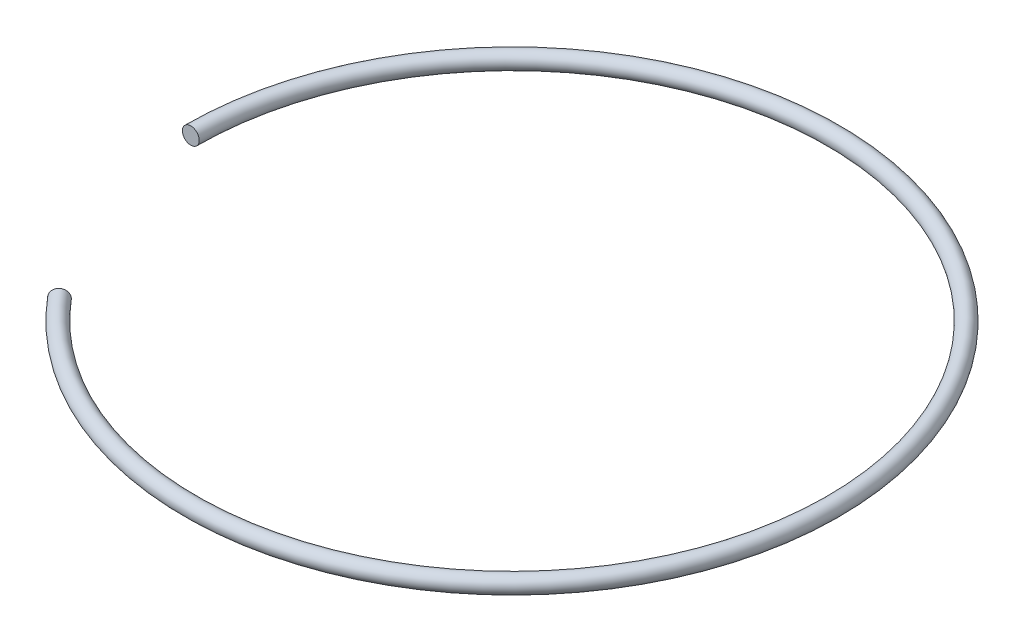
ISO-10303-21;
HEADER;
FILE_DESCRIPTION(('STEP AP214'),'2;1');
FILE_NAME('part.step','',(''),(''),'','','');
FILE_SCHEMA(('AUTOMOTIVE_DESIGN { 1 0 10303 214 1 1 1 1 }'));
ENDSEC;
DATA;
#1=APPLICATION_CONTEXT('core data for automotive mechanical design processes');
#2=APPLICATION_PROTOCOL_DEFINITION('international standard','automotive_design',2000,#1);
#3=PRODUCT_CONTEXT('',#1,'mechanical');
#4=PRODUCT('Part','Part','',(#3));
#5=PRODUCT_RELATED_PRODUCT_CATEGORY('part','',(#4));
#6=PRODUCT_DEFINITION_FORMATION('','',#4);
#7=PRODUCT_DEFINITION_CONTEXT('part definition',#1,'design');
#8=PRODUCT_DEFINITION('design','',#6,#7);
#9=PRODUCT_DEFINITION_SHAPE('','',#8);
#10=(LENGTH_UNIT() NAMED_UNIT(*) SI_UNIT(.MILLI.,.METRE.));
#11=(NAMED_UNIT(*) PLANE_ANGLE_UNIT() SI_UNIT($,.RADIAN.));
#12=(NAMED_UNIT(*) SI_UNIT($,.STERADIAN.) SOLID_ANGLE_UNIT());
#13=UNCERTAINTY_MEASURE_WITH_UNIT(LENGTH_MEASURE(1.E-05),#10,'distance_accuracy_value','');
#14=(GEOMETRIC_REPRESENTATION_CONTEXT(3) GLOBAL_UNCERTAINTY_ASSIGNED_CONTEXT((#13)) GLOBAL_UNIT_ASSIGNED_CONTEXT((#10,
#11,#12)) REPRESENTATION_CONTEXT('',''));
#15=CARTESIAN_POINT('',(0.,0.,0.));
#16=DIRECTION('',(0.,0.,1.));
#17=DIRECTION('',(1.,0.,0.));
#18=AXIS2_PLACEMENT_3D('',#15,#16,#17);
#19=CARTESIAN_POINT('',(0.,5.,0.));
#20=DIRECTION('',(0.,0.,1.));
#21=DIRECTION('',(1.,0.,0.));
#22=AXIS2_PLACEMENT_3D('',#19,#20,#21);
#23=PLANE('',#22);
#24=CARTESIAN_POINT('',(-5.575,0.440000000000001,0.));
#25=CARTESIAN_POINT('',(-5.57501062983499,0.42319249164499,0.));
#26=CARTESIAN_POINT('',(-5.57787538462174,0.406281558710685,0.));
#27=CARTESIAN_POINT('',(-5.58903597751349,0.374416764003044,0.));
#28=CARTESIAN_POINT('',(-5.59733181561848,0.359462902229706,0.));
#29=CARTESIAN_POINT('',(-5.61840700512756,0.333129254032241,0.));
#30=CARTESIAN_POINT('',(-5.63118635653177,0.321749467608205,0.));
#31=CARTESIAN_POINT('',(-5.65979109373738,0.303865334950795,0.));
#32=CARTESIAN_POINT('',(-5.67561647953878,0.297360988717422,0.));
#33=CARTESIAN_POINT('',(-5.70852818642906,0.289956461444852,0.));
#34=CARTESIAN_POINT('',(-5.72561450751794,0.289056280405655,0.));
#35=CARTESIAN_POINT('',(-5.75912206349802,0.292961554634673,0.));
#36=CARTESIAN_POINT('',(-5.77554329838922,0.297767009902889,0.));
#37=CARTESIAN_POINT('',(-5.80586889279606,0.312546438693667,0.));
#38=CARTESIAN_POINT('',(-5.81977325231169,0.322520412216229,0.));
#39=CARTESIAN_POINT('',(-5.84349883134805,0.346493762829983,0.));
#40=CARTESIAN_POINT('',(-5.85332005086878,0.360493139921175,0.));
#41=CARTESIAN_POINT('',(-5.86776711566352,0.391008812850514,0.));
#42=CARTESIAN_POINT('',(-5.87239296093752,0.40752510868866,0.));
#43=CARTESIAN_POINT('',(-5.87472637429642,0.429476017085077,0.));
#44=CARTESIAN_POINT('',(-5.87500333113523,0.434732930161899,0.));
#45=CARTESIAN_POINT('',(-5.87498937016501,0.456807508355013,0.));
#46=CARTESIAN_POINT('',(-5.87212461537826,0.473718441289317,0.));
#47=CARTESIAN_POINT('',(-5.86096402248651,0.505583235996959,0.));
#48=CARTESIAN_POINT('',(-5.85266818438152,0.520537097770296,0.));
#49=CARTESIAN_POINT('',(-5.83159299487244,0.546870745967761,0.));
#50=CARTESIAN_POINT('',(-5.81881364346823,0.558250532391798,0.));
#51=CARTESIAN_POINT('',(-5.79020890626262,0.576134665049207,0.));
#52=CARTESIAN_POINT('',(-5.77438352046122,0.58263901128258,0.));
#53=CARTESIAN_POINT('',(-5.74147181357094,0.59004353855515,0.));
#54=CARTESIAN_POINT('',(-5.72438549248206,0.590943719594348,0.));
#55=CARTESIAN_POINT('',(-5.69087793650198,0.587038445365329,0.));
#56=CARTESIAN_POINT('',(-5.67445670161078,0.582232990097113,0.));
#57=CARTESIAN_POINT('',(-5.64413110720394,0.567453561306335,0.));
#58=CARTESIAN_POINT('',(-5.63022674768831,0.557479587783773,0.));
#59=CARTESIAN_POINT('',(-5.60650116865195,0.533506237170019,0.));
#60=CARTESIAN_POINT('',(-5.59667994913122,0.519506860078827,0.));
#61=CARTESIAN_POINT('',(-5.58223288433648,0.488991187149488,0.));
#62=CARTESIAN_POINT('',(-5.57760703906248,0.472474891311342,0.));
#63=CARTESIAN_POINT('',(-5.57527362570358,0.450523982914926,0.));
#64=CARTESIAN_POINT('',(-5.57499666886477,0.445267069838103,0.));
#65=CARTESIAN_POINT('',(-5.575,0.440000000000001,0.));
#66=B_SPLINE_CURVE_WITH_KNOTS('',3,(#24,#25,#26,#27,#28,#29,#30,#31,#32,#33,#34,#35,#36,#37,#38,
#39,#40,#41,#42,#43,#44,#45,#46,#47,#48,#49,#50,#51,#52,#53,#54,#55,#56,#57,#58,#59,#60,#61,#62,
#63,#64,#65),.UNSPECIFIED.,.T.,.F.,(4,2,2,2,2,2,2,2,2,2,2,2,2,2,2,2,2,2,2,2,4),(0.,
0.0503657057955508,0.100731411591102,0.151097117387924,0.201462823184746,0.251828528981568,
0.302194234778389,0.352559940575211,0.402925646372032,0.453291352168854,0.469074755887429,
0.51944046168298,0.56980616747853,0.620171873275352,0.670537579072173,0.720903284868996,
0.771268990665818,0.821634696462639,0.872000402259462,0.922366108056283,0.938149511774858),.UNSPECIFIED.);
#67=CARTESIAN_POINT('',(-5.575,0.440000000000001,0.));
#68=VERTEX_POINT('',#67);
#69=EDGE_CURVE('E19',#68,#68,#66,.T.);
#70=ORIENTED_EDGE('',*,*,#69,.F.);
#71=EDGE_LOOP('',(#70));
#72=FACE_BOUND('',#71,.T.);
#73=ADVANCED_FACE('F15',(#72),#23,.T.);
#74=CARTESIAN_POINT('',(0.,5.,0.));
#75=DIRECTION('',(0.64278760968653,0.,0.766044443118986));
#76=DIRECTION('',(0.766044443118986,0.,-0.64278760968653));
#77=AXIS2_PLACEMENT_3D('',#74,#75,#76);
#78=PLANE('',#77);
#79=CARTESIAN_POINT('',(-4.50051110332404,0.440000000000001,3.77637720690836));
#80=CARTESIAN_POINT('',(-4.50050296039802,0.42319249164499,3.77637037418214));
#81=CARTESIAN_POINT('',(-4.49830843091273,0.406281558710685,3.77452894530043));
#82=CARTESIAN_POINT('',(-4.48975892074609,0.374416764003044,3.76735505447286));
#83=CARTESIAN_POINT('',(-4.48340394006475,0.359462902229706,3.762022592527));
#84=CARTESIAN_POINT('',(-4.46725940825363,0.333129254032242,3.74847572183877));
#85=CARTESIAN_POINT('',(-4.45746985712378,0.321749467608205,3.74026131309631));
#86=CARTESIAN_POINT('',(-4.43555735714054,0.303865334950795,3.72187454244221));
#87=CARTESIAN_POINT('',(-4.42343440828716,0.297360988717422,3.71170218053056));
#88=CARTESIAN_POINT('',(-4.3982225781103,0.289956461444851,3.69054694312785));
#89=CARTESIAN_POINT('',(-4.38513369678682,0.289056280405655,3.6795640676368));
#90=CARTESIAN_POINT('',(-4.35946541972578,0.292961554634673,3.65802582582192));
#91=CARTESIAN_POINT('',(-4.34688602398823,0.297767009902889,3.6474704594981));
#92=CARTESIAN_POINT('',(-4.32365527090859,0.312546438693667,3.62797754315701));
#93=CARTESIAN_POINT('',(-4.31300391356651,0.32252041221623,3.61903999313973));
#94=CARTESIAN_POINT('',(-4.29482906558593,0.346493762829984,3.60378948490252));
#95=CARTESIAN_POINT('',(-4.28730557494742,0.360493139921176,3.59747652668259));
#96=CARTESIAN_POINT('',(-4.27623848124203,0.391008812850513,3.58819013243619));
#97=CARTESIAN_POINT('',(-4.27269487817515,0.40752510868866,3.58521669640973));
#98=CARTESIAN_POINT('',(-4.27090737983807,0.429476017085076,3.58371680721436));
#99=CARTESIAN_POINT('',(-4.27069521859071,0.434732930161899,3.58353878278995));
#100=CARTESIAN_POINT('',(-4.27070591331437,0.456807508355013,3.58354775672863));
#101=CARTESIAN_POINT('',(-4.27290044279966,0.473718441289317,3.58538918561034));
#102=CARTESIAN_POINT('',(-4.28144995296629,0.505583235996959,3.59256307643791));
#103=CARTESIAN_POINT('',(-4.28780493364764,0.520537097770296,3.59789553838377));
#104=CARTESIAN_POINT('',(-4.30394946545875,0.546870745967761,3.611442409072));
#105=CARTESIAN_POINT('',(-4.31373901658861,0.558250532391797,3.61965681781445));
#106=CARTESIAN_POINT('',(-4.33565151657184,0.576134665049207,3.63804358846856));
#107=CARTESIAN_POINT('',(-4.34777446542523,0.58263901128258,3.64821595038021));
#108=CARTESIAN_POINT('',(-4.37298629560209,0.59004353855515,3.66937118778292));
#109=CARTESIAN_POINT('',(-4.38607517692556,0.590943719594348,3.68035406327397));
#110=CARTESIAN_POINT('',(-4.4117434539866,0.587038445365329,3.70189230508885));
#111=CARTESIAN_POINT('',(-4.42432284972416,0.582232990097113,3.71244767141267));
#112=CARTESIAN_POINT('',(-4.4475536028038,0.567453561306335,3.73194058775376));
#113=CARTESIAN_POINT('',(-4.45820496014588,0.557479587783773,3.74087813777104));
#114=CARTESIAN_POINT('',(-4.47637980812646,0.533506237170019,3.75612864600825));
#115=CARTESIAN_POINT('',(-4.48390329876497,0.519506860078827,3.76244160422818));
#116=CARTESIAN_POINT('',(-4.49497039247036,0.488991187149488,3.77172799847458));
#117=CARTESIAN_POINT('',(-4.49851399553724,0.472474891311342,3.77470143450103));
#118=CARTESIAN_POINT('',(-4.50030149387432,0.450523982914926,3.77620132369641));
#119=CARTESIAN_POINT('',(-4.50051365512168,0.445267069838103,3.77637934812082));
#120=CARTESIAN_POINT('',(-4.50051110332404,0.440000000000001,3.77637720690836));
#121=B_SPLINE_CURVE_WITH_KNOTS('',3,(#79,#80,#81,#82,#83,#84,#85,#86,#87,#88,#89,#90,#91,#92,
#93,#94,#95,#96,#97,#98,#99,#100,#101,#102,#103,#104,#105,#106,#107,#108,#109,#110,#111,#112,
#113,#114,#115,#116,#117,#118,#119,#120),.UNSPECIFIED.,.T.,.F.,(4,2,2,2,2,2,2,2,2,2,2,2,2,2,2,2,
2,2,2,2,4),(0.,0.0503657057955506,0.100731411591101,0.151097117387924,0.201462823184746,
0.251828528981567,0.302194234778389,0.352559940575211,0.402925646372031,0.453291352168854,
0.469074755887429,0.51944046168298,0.569806167478531,0.620171873275352,0.670537579072175,
0.720903284868995,0.771268990665818,0.82163469646264,0.872000402259462,0.922366108056283,
0.938149511774858),.UNSPECIFIED.);
#122=CARTESIAN_POINT('',(-4.50051110332404,0.440000000000001,3.77637720690836));
#123=VERTEX_POINT('',#122);
#124=EDGE_CURVE('E10',#123,#123,#121,.T.);
#125=ORIENTED_EDGE('',*,*,#124,.F.);
#126=EDGE_LOOP('',(#125));
#127=FACE_BOUND('',#126,.T.);
#128=ADVANCED_FACE('F35',(#127),#78,.F.);
#129=CARTESIAN_POINT('',(0.,0.440000000000001,0.));
#130=DIRECTION('',(0.,-1.,0.));
#131=DIRECTION('',(0.,0.,1.));
#132=AXIS2_PLACEMENT_3D('',#129,#130,#131);
#133=TOROIDAL_SURFACE('',#132,5.725,0.150000000000001);
#134=ORIENTED_EDGE('',*,*,#124,.T.);
#135=EDGE_LOOP('',(#134));
#136=FACE_BOUND('',#135,.T.);
#137=ORIENTED_EDGE('',*,*,#69,.T.);
#138=EDGE_LOOP('',(#137));
#139=FACE_BOUND('',#138,.T.);
#140=ADVANCED_FACE('F37',(#136,#139),#133,.T.);
#141=CLOSED_SHELL('',(#73,#128,#140));
#142=MANIFOLD_SOLID_BREP('B1',#141);
#143=ADVANCED_BREP_SHAPE_REPRESENTATION('',(#18,#142),#14);
#144=SHAPE_DEFINITION_REPRESENTATION(#9,#143);
ENDSEC;
END-ISO-10303-21;
